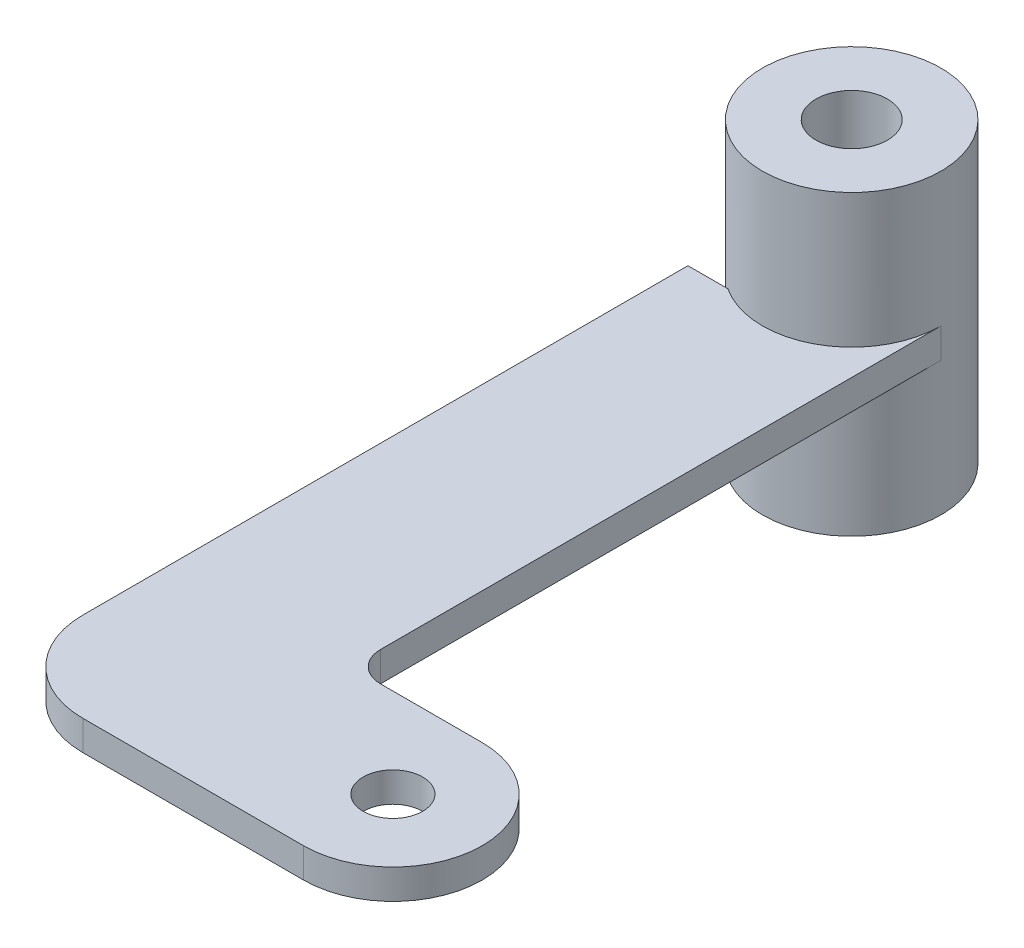
ISO-10303-21;
HEADER;
FILE_DESCRIPTION(('STEP AP214'),'2;1');
FILE_NAME('part.step','',(''),(''),'','','');
FILE_SCHEMA(('AUTOMOTIVE_DESIGN { 1 0 10303 214 1 1 1 1 }'));
ENDSEC;
DATA;
#1=APPLICATION_CONTEXT('core data for automotive mechanical design processes');
#2=APPLICATION_PROTOCOL_DEFINITION('international standard','automotive_design',2000,#1);
#3=PRODUCT_CONTEXT('',#1,'mechanical');
#4=PRODUCT('Part','Part','',(#3));
#5=PRODUCT_RELATED_PRODUCT_CATEGORY('part','',(#4));
#6=PRODUCT_DEFINITION_FORMATION('','',#4);
#7=PRODUCT_DEFINITION_CONTEXT('part definition',#1,'design');
#8=PRODUCT_DEFINITION('design','',#6,#7);
#9=PRODUCT_DEFINITION_SHAPE('','',#8);
#10=(LENGTH_UNIT() NAMED_UNIT(*) SI_UNIT(.MILLI.,.METRE.));
#11=(NAMED_UNIT(*) PLANE_ANGLE_UNIT() SI_UNIT($,.RADIAN.));
#12=(NAMED_UNIT(*) SI_UNIT($,.STERADIAN.) SOLID_ANGLE_UNIT());
#13=UNCERTAINTY_MEASURE_WITH_UNIT(LENGTH_MEASURE(1.E-05),#10,'distance_accuracy_value','');
#14=(GEOMETRIC_REPRESENTATION_CONTEXT(3) GLOBAL_UNCERTAINTY_ASSIGNED_CONTEXT((#13)) GLOBAL_UNIT_ASSIGNED_CONTEXT((#10,
#11,#12)) REPRESENTATION_CONTEXT('',''));
#15=CARTESIAN_POINT('',(0.,0.,0.));
#16=DIRECTION('',(0.,0.,1.));
#17=DIRECTION('',(1.,0.,0.));
#18=AXIS2_PLACEMENT_3D('',#15,#16,#17);
#19=CARTESIAN_POINT('',(6.,-5.,0.));
#20=DIRECTION('',(0.,1.,0.));
#21=DIRECTION('',(0.,0.,1.));
#22=AXIS2_PLACEMENT_3D('',#19,#20,#21);
#23=PLANE('',#22);
#24=CARTESIAN_POINT('',(0.,-5.,0.));
#25=DIRECTION('',(0.,1.,0.));
#26=DIRECTION('',(0.,0.,1.));
#27=AXIS2_PLACEMENT_3D('',#24,#25,#26);
#28=CIRCLE('',#27,5.99999999999999);
#29=CARTESIAN_POINT('',(0.,-5.,5.99999999999999));
#30=VERTEX_POINT('',#29);
#31=EDGE_CURVE('E166',#30,#30,#28,.T.);
#32=ORIENTED_EDGE('',*,*,#31,.F.);
#33=EDGE_LOOP('',(#32));
#34=FACE_BOUND('',#33,.T.);
#35=CARTESIAN_POINT('',(0.,-5.,0.));
#36=DIRECTION('',(0.,1.,0.));
#37=DIRECTION('',(0.,0.,1.));
#38=AXIS2_PLACEMENT_3D('',#35,#36,#37);
#39=CIRCLE('',#38,4.99999999999999);
#40=CARTESIAN_POINT('',(0.,-5.,4.99999999999999));
#41=VERTEX_POINT('',#40);
#42=EDGE_CURVE('E140',#41,#41,#39,.T.);
#43=ORIENTED_EDGE('',*,*,#42,.T.);
#44=EDGE_LOOP('',(#43));
#45=FACE_BOUND('',#44,.T.);
#46=ADVANCED_FACE('F43',(#34,#45),#23,.F.);
#47=CARTESIAN_POINT('',(0.,25.,0.));
#48=DIRECTION('',(0.,1.,0.));
#49=DIRECTION('',(0.,0.,1.));
#50=AXIS2_PLACEMENT_3D('',#47,#48,#49);
#51=CYLINDRICAL_SURFACE('',#50,5.99999999999999);
#52=CARTESIAN_POINT('',(0.,-25.,0.));
#53=DIRECTION('',(0.,1.,0.));
#54=DIRECTION('',(0.,0.,1.));
#55=AXIS2_PLACEMENT_3D('',#52,#53,#54);
#56=CIRCLE('',#55,5.99999999999999);
#57=CARTESIAN_POINT('',(0.,-25.,5.99999999999999));
#58=VERTEX_POINT('',#57);
#59=EDGE_CURVE('E163',#58,#58,#56,.T.);
#60=ORIENTED_EDGE('',*,*,#59,.F.);
#61=EDGE_LOOP('',(#60));
#62=FACE_BOUND('',#61,.T.);
#63=ORIENTED_EDGE('',*,*,#31,.T.);
#64=EDGE_LOOP('',(#63));
#65=FACE_BOUND('',#64,.T.);
#66=ADVANCED_FACE('F247',(#62,#65),#51,.F.);
#67=CARTESIAN_POINT('',(15.,-25.,0.));
#68=DIRECTION('',(0.,1.,0.));
#69=DIRECTION('',(0.,0.,1.));
#70=AXIS2_PLACEMENT_3D('',#67,#68,#69);
#71=PLANE('',#70);
#72=CARTESIAN_POINT('',(0.,-25.,0.));
#73=DIRECTION('',(0.,1.,0.));
#74=DIRECTION('',(0.,0.,1.));
#75=AXIS2_PLACEMENT_3D('',#72,#73,#74);
#76=CIRCLE('',#75,15.);
#77=CARTESIAN_POINT('',(0.,-25.,15.));
#78=VERTEX_POINT('',#77);
#79=EDGE_CURVE('E160',#78,#78,#76,.T.);
#80=ORIENTED_EDGE('',*,*,#79,.F.);
#81=EDGE_LOOP('',(#80));
#82=FACE_BOUND('',#81,.T.);
#83=ORIENTED_EDGE('',*,*,#59,.T.);
#84=EDGE_LOOP('',(#83));
#85=FACE_BOUND('',#84,.T.);
#86=ADVANCED_FACE('F252',(#82,#85),#71,.F.);
#87=CARTESIAN_POINT('',(0.,25.,0.));
#88=DIRECTION('',(0.,1.,0.));
#89=DIRECTION('',(0.,0.,1.));
#90=AXIS2_PLACEMENT_3D('',#87,#88,#89);
#91=CYLINDRICAL_SURFACE('',#90,15.);
#92=DIRECTION('',(0.,-1.,0.));
#93=VECTOR('',#92,1.);
#94=CARTESIAN_POINT('',(-8.29156197588848,2.5,12.5));
#95=LINE('',#94,#93);
#96=CARTESIAN_POINT('',(-8.29156197588848,2.5,12.5));
#97=VERTEX_POINT('',#96);
#98=CARTESIAN_POINT('',(-8.29156197588848,-2.5,12.5));
#99=VERTEX_POINT('',#98);
#100=EDGE_CURVE('E222',#97,#99,#95,.T.);
#101=ORIENTED_EDGE('',*,*,#100,.F.);
#102=CARTESIAN_POINT('',(0.,2.5,0.));
#103=DIRECTION('',(0.,1.,0.));
#104=DIRECTION('',(0.,0.,1.));
#105=AXIS2_PLACEMENT_3D('',#102,#103,#104);
#106=CIRCLE('',#105,15.);
#107=CARTESIAN_POINT('',(15.,2.5,0.));
#108=VERTEX_POINT('',#107);
#109=EDGE_CURVE('E196',#97,#108,#106,.T.);
#110=ORIENTED_EDGE('',*,*,#109,.T.);
#111=DIRECTION('',(0.,-1.,0.));
#112=VECTOR('',#111,1.);
#113=CARTESIAN_POINT('',(15.,2.5,0.));
#114=LINE('',#113,#112);
#115=CARTESIAN_POINT('',(15.,-2.5,0.));
#116=VERTEX_POINT('',#115);
#117=EDGE_CURVE('E145',#108,#116,#114,.T.);
#118=ORIENTED_EDGE('',*,*,#117,.T.);
#119=CARTESIAN_POINT('',(0.,-2.5,0.));
#120=DIRECTION('',(0.,1.,0.));
#121=DIRECTION('',(0.,0.,1.));
#122=AXIS2_PLACEMENT_3D('',#119,#120,#121);
#123=CIRCLE('',#122,15.);
#124=EDGE_CURVE('E213',#99,#116,#123,.T.);
#125=ORIENTED_EDGE('',*,*,#124,.F.);
#126=EDGE_LOOP('',(#101,#110,#118,#125));
#127=FACE_BOUND('',#126,.T.);
#128=CARTESIAN_POINT('',(0.,25.,0.));
#129=DIRECTION('',(0.,1.,0.));
#130=DIRECTION('',(0.,0.,1.));
#131=AXIS2_PLACEMENT_3D('',#128,#129,#130);
#132=CIRCLE('',#131,15.);
#133=CARTESIAN_POINT('',(0.,25.,15.));
#134=VERTEX_POINT('',#133);
#135=EDGE_CURVE('E157',#134,#134,#132,.T.);
#136=ORIENTED_EDGE('',*,*,#135,.F.);
#137=EDGE_LOOP('',(#136));
#138=FACE_BOUND('',#137,.T.);
#139=ORIENTED_EDGE('',*,*,#79,.T.);
#140=EDGE_LOOP('',(#139));
#141=FACE_BOUND('',#140,.T.);
#142=ADVANCED_FACE('F225',(#127,#138,#141),#91,.T.);
#143=CARTESIAN_POINT('',(5.99999999999999,25.,0.));
#144=DIRECTION('',(0.,-1.,0.));
#145=DIRECTION('',(0.,0.,-1.));
#146=AXIS2_PLACEMENT_3D('',#143,#144,#145);
#147=PLANE('',#146);
#148=CARTESIAN_POINT('',(0.,25.,0.));
#149=DIRECTION('',(0.,1.,0.));
#150=DIRECTION('',(0.,0.,1.));
#151=AXIS2_PLACEMENT_3D('',#148,#149,#150);
#152=CIRCLE('',#151,5.99999999999998);
#153=CARTESIAN_POINT('',(0.,25.,5.99999999999998));
#154=VERTEX_POINT('',#153);
#155=EDGE_CURVE('E154',#154,#154,#152,.T.);
#156=ORIENTED_EDGE('',*,*,#155,.F.);
#157=EDGE_LOOP('',(#156));
#158=FACE_BOUND('',#157,.T.);
#159=ORIENTED_EDGE('',*,*,#135,.T.);
#160=EDGE_LOOP('',(#159));
#161=FACE_BOUND('',#160,.T.);
#162=ADVANCED_FACE('F263',(#158,#161),#147,.F.);
#163=CARTESIAN_POINT('',(0.,25.,0.));
#164=DIRECTION('',(0.,1.,0.));
#165=DIRECTION('',(0.,0.,1.));
#166=AXIS2_PLACEMENT_3D('',#163,#164,#165);
#167=CYLINDRICAL_SURFACE('',#166,5.99999999999998);
#168=CARTESIAN_POINT('',(0.,5.,0.));
#169=DIRECTION('',(0.,1.,0.));
#170=DIRECTION('',(0.,0.,1.));
#171=AXIS2_PLACEMENT_3D('',#168,#169,#170);
#172=CIRCLE('',#171,5.99999999999999);
#173=CARTESIAN_POINT('',(0.,5.,5.99999999999999));
#174=VERTEX_POINT('',#173);
#175=EDGE_CURVE('E151',#174,#174,#172,.T.);
#176=ORIENTED_EDGE('',*,*,#175,.F.);
#177=EDGE_LOOP('',(#176));
#178=FACE_BOUND('',#177,.T.);
#179=ORIENTED_EDGE('',*,*,#155,.T.);
#180=EDGE_LOOP('',(#179));
#181=FACE_BOUND('',#180,.T.);
#182=ADVANCED_FACE('F266',(#178,#181),#167,.F.);
#183=CARTESIAN_POINT('',(5.,5.,0.));
#184=DIRECTION('',(0.,-1.,0.));
#185=DIRECTION('',(0.,0.,-1.));
#186=AXIS2_PLACEMENT_3D('',#183,#184,#185);
#187=PLANE('',#186);
#188=CARTESIAN_POINT('',(0.,5.,0.));
#189=DIRECTION('',(0.,1.,0.));
#190=DIRECTION('',(0.,0.,1.));
#191=AXIS2_PLACEMENT_3D('',#188,#189,#190);
#192=CIRCLE('',#191,4.99999999999999);
#193=CARTESIAN_POINT('',(0.,5.,4.99999999999999));
#194=VERTEX_POINT('',#193);
#195=EDGE_CURVE('E143',#194,#194,#192,.T.);
#196=ORIENTED_EDGE('',*,*,#195,.F.);
#197=EDGE_LOOP('',(#196));
#198=FACE_BOUND('',#197,.T.);
#199=ORIENTED_EDGE('',*,*,#175,.T.);
#200=EDGE_LOOP('',(#199));
#201=FACE_BOUND('',#200,.T.);
#202=ADVANCED_FACE('F270',(#198,#201),#187,.F.);
#203=CARTESIAN_POINT('',(0.,25.,0.));
#204=DIRECTION('',(0.,1.,0.));
#205=DIRECTION('',(0.,0.,1.));
#206=AXIS2_PLACEMENT_3D('',#203,#204,#205);
#207=CYLINDRICAL_SURFACE('',#206,4.99999999999999);
#208=ORIENTED_EDGE('',*,*,#42,.F.);
#209=EDGE_LOOP('',(#208));
#210=FACE_BOUND('',#209,.T.);
#211=ORIENTED_EDGE('',*,*,#195,.T.);
#212=EDGE_LOOP('',(#211));
#213=FACE_BOUND('',#212,.T.);
#214=ADVANCED_FACE('F274',(#210,#213),#207,.F.);
#215=CARTESIAN_POINT('',(0.,2.5,129.126781955418));
#216=DIRECTION('',(0.,0.,-1.));
#217=DIRECTION('',(-1.,0.,0.));
#218=AXIS2_PLACEMENT_3D('',#215,#216,#217);
#219=PLANE('',#218);
#220=DIRECTION('',(1.,0.,0.));
#221=VECTOR('',#220,1.);
#222=CARTESIAN_POINT('',(0.,2.5,129.126781955418));
#223=LINE('',#222,#221);
#224=CARTESIAN_POINT('',(0.,2.5,129.126781955418));
#225=VERTEX_POINT('',#224);
#226=CARTESIAN_POINT('',(37.0820393249942,2.5,129.126781955418));
#227=VERTEX_POINT('',#226);
#228=EDGE_CURVE('E113',#225,#227,#223,.T.);
#229=ORIENTED_EDGE('',*,*,#228,.F.);
#230=DIRECTION('',(0.,-1.,0.));
#231=VECTOR('',#230,1.);
#232=CARTESIAN_POINT('',(0.,-2.5,129.126781955418));
#233=LINE('',#232,#231);
#234=CARTESIAN_POINT('',(0.,-2.5,129.126781955418));
#235=VERTEX_POINT('',#234);
#236=EDGE_CURVE('E169',#225,#235,#233,.T.);
#237=ORIENTED_EDGE('',*,*,#236,.T.);
#238=DIRECTION('',(1.,0.,0.));
#239=VECTOR('',#238,1.);
#240=CARTESIAN_POINT('',(0.,-2.5,129.126781955418));
#241=LINE('',#240,#239);
#242=CARTESIAN_POINT('',(37.0820393249942,-2.5,129.126781955418));
#243=VERTEX_POINT('',#242);
#244=EDGE_CURVE('E138',#235,#243,#241,.T.);
#245=ORIENTED_EDGE('',*,*,#244,.T.);
#246=DIRECTION('',(0.,-1.,0.));
#247=VECTOR('',#246,1.);
#248=CARTESIAN_POINT('',(37.0820393249942,2.5,129.126781955418));
#249=LINE('',#248,#247);
#250=EDGE_CURVE('E131',#227,#243,#249,.T.);
#251=ORIENTED_EDGE('',*,*,#250,.F.);
#252=EDGE_LOOP('',(#229,#237,#245,#251));
#253=FACE_BOUND('',#252,.T.);
#254=ADVANCED_FACE('F136',(#253),#219,.F.);
#255=CARTESIAN_POINT('',(37.0820393249942,2.5,114.126781955418));
#256=DIRECTION('',(0.,-1.,0.));
#257=DIRECTION('',(0.,0.,-1.));
#258=AXIS2_PLACEMENT_3D('',#255,#256,#257);
#259=CYLINDRICAL_SURFACE('',#258,15.);
#260=CARTESIAN_POINT('',(37.0820393249942,-2.5,114.126781955418));
#261=DIRECTION('',(0.,1.,0.));
#262=DIRECTION('',(0.,0.,1.));
#263=AXIS2_PLACEMENT_3D('',#260,#261,#262);
#264=CIRCLE('',#263,15.);
#265=CARTESIAN_POINT('',(37.0820393249942,-2.5,99.1267819554182));
#266=VERTEX_POINT('',#265);
#267=EDGE_CURVE('E189',#243,#266,#264,.T.);
#268=ORIENTED_EDGE('',*,*,#267,.T.);
#269=DIRECTION('',(0.,-1.,0.));
#270=VECTOR('',#269,1.);
#271=CARTESIAN_POINT('',(37.0820393249942,2.5,99.1267819554182));
#272=LINE('',#271,#270);
#273=CARTESIAN_POINT('',(37.0820393249942,2.5,99.1267819554182));
#274=VERTEX_POINT('',#273);
#275=EDGE_CURVE('E133',#274,#266,#272,.T.);
#276=ORIENTED_EDGE('',*,*,#275,.F.);
#277=CARTESIAN_POINT('',(37.0820393249942,2.5,114.126781955418));
#278=DIRECTION('',(0.,1.,0.));
#279=DIRECTION('',(0.,0.,1.));
#280=AXIS2_PLACEMENT_3D('',#277,#278,#279);
#281=CIRCLE('',#280,15.);
#282=EDGE_CURVE('E117',#227,#274,#281,.T.);
#283=ORIENTED_EDGE('',*,*,#282,.F.);
#284=ORIENTED_EDGE('',*,*,#250,.T.);
#285=EDGE_LOOP('',(#268,#276,#283,#284));
#286=FACE_BOUND('',#285,.T.);
#287=ADVANCED_FACE('F130',(#286),#259,.T.);
#288=CARTESIAN_POINT('',(0.,2.5,99.1267819554182));
#289=DIRECTION('',(0.,0.,-1.));
#290=DIRECTION('',(-1.,0.,0.));
#291=AXIS2_PLACEMENT_3D('',#288,#289,#290);
#292=PLANE('',#291);
#293=DIRECTION('',(1.,0.,0.));
#294=VECTOR('',#293,1.);
#295=CARTESIAN_POINT('',(0.,-2.5,99.1267819554182));
#296=LINE('',#295,#294);
#297=CARTESIAN_POINT('',(20.,-2.5,99.1267819554182));
#298=VERTEX_POINT('',#297);
#299=EDGE_CURVE('E182',#298,#266,#296,.T.);
#300=ORIENTED_EDGE('',*,*,#299,.F.);
#301=DIRECTION('',(0.,-1.,0.));
#302=VECTOR('',#301,1.);
#303=CARTESIAN_POINT('',(20.,2.5,99.1267819554182));
#304=LINE('',#303,#302);
#305=CARTESIAN_POINT('',(20.,2.5,99.1267819554182));
#306=VERTEX_POINT('',#305);
#307=EDGE_CURVE('E64',#298,#306,#304,.F.);
#308=ORIENTED_EDGE('',*,*,#307,.T.);
#309=DIRECTION('',(1.,0.,0.));
#310=VECTOR('',#309,1.);
#311=CARTESIAN_POINT('',(0.,2.5,99.1267819554182));
#312=LINE('',#311,#310);
#313=EDGE_CURVE('E134',#306,#274,#312,.T.);
#314=ORIENTED_EDGE('',*,*,#313,.T.);
#315=ORIENTED_EDGE('',*,*,#275,.T.);
#316=EDGE_LOOP('',(#300,#308,#314,#315));
#317=FACE_BOUND('',#316,.T.);
#318=ADVANCED_FACE('F188',(#317),#292,.T.);
#319=CARTESIAN_POINT('',(15.,2.5,0.));
#320=DIRECTION('',(1.,0.,0.));
#321=DIRECTION('',(0.,0.,-1.));
#322=AXIS2_PLACEMENT_3D('',#319,#320,#321);
#323=PLANE('',#322);
#324=DIRECTION('',(0.,0.,1.));
#325=VECTOR('',#324,1.);
#326=CARTESIAN_POINT('',(15.,2.5,0.));
#327=LINE('',#326,#325);
#328=CARTESIAN_POINT('',(15.,2.5,94.1267819554182));
#329=VERTEX_POINT('',#328);
#330=EDGE_CURVE('E194',#108,#329,#327,.T.);
#331=ORIENTED_EDGE('',*,*,#330,.T.);
#332=DIRECTION('',(0.,-1.,0.));
#333=VECTOR('',#332,1.);
#334=CARTESIAN_POINT('',(15.,-2.5,94.1267819554182));
#335=LINE('',#334,#333);
#336=CARTESIAN_POINT('',(15.,-2.5,94.1267819554182));
#337=VERTEX_POINT('',#336);
#338=EDGE_CURVE('E176',#329,#337,#335,.T.);
#339=ORIENTED_EDGE('',*,*,#338,.T.);
#340=DIRECTION('',(0.,0.,1.));
#341=VECTOR('',#340,1.);
#342=CARTESIAN_POINT('',(15.,-2.5,0.));
#343=LINE('',#342,#341);
#344=EDGE_CURVE('E185',#116,#337,#343,.T.);
#345=ORIENTED_EDGE('',*,*,#344,.F.);
#346=ORIENTED_EDGE('',*,*,#117,.F.);
#347=EDGE_LOOP('',(#331,#339,#345,#346));
#348=FACE_BOUND('',#347,.T.);
#349=ADVANCED_FACE('F192',(#348),#323,.T.);
#350=CARTESIAN_POINT('',(0.,2.5,12.5));
#351=DIRECTION('',(0.,0.,-1.));
#352=DIRECTION('',(-1.,0.,0.));
#353=AXIS2_PLACEMENT_3D('',#350,#351,#352);
#354=PLANE('',#353);
#355=DIRECTION('',(1.,0.,0.));
#356=VECTOR('',#355,1.);
#357=CARTESIAN_POINT('',(0.,-2.5,12.5));
#358=LINE('',#357,#356);
#359=CARTESIAN_POINT('',(-15.,-2.5,12.5));
#360=VERTEX_POINT('',#359);
#361=EDGE_CURVE('E215',#360,#99,#358,.T.);
#362=ORIENTED_EDGE('',*,*,#361,.F.);
#363=DIRECTION('',(0.,-1.,0.));
#364=VECTOR('',#363,1.);
#365=CARTESIAN_POINT('',(-15.,2.5,12.5));
#366=LINE('',#365,#364);
#367=CARTESIAN_POINT('',(-15.,2.5,12.5));
#368=VERTEX_POINT('',#367);
#369=EDGE_CURVE('E206',#368,#360,#366,.T.);
#370=ORIENTED_EDGE('',*,*,#369,.F.);
#371=DIRECTION('',(1.,0.,0.));
#372=VECTOR('',#371,1.);
#373=CARTESIAN_POINT('',(0.,2.5,12.5));
#374=LINE('',#373,#372);
#375=EDGE_CURVE('E198',#368,#97,#374,.T.);
#376=ORIENTED_EDGE('',*,*,#375,.T.);
#377=ORIENTED_EDGE('',*,*,#100,.T.);
#378=EDGE_LOOP('',(#362,#370,#376,#377));
#379=FACE_BOUND('',#378,.T.);
#380=ADVANCED_FACE('F231',(#379),#354,.T.);
#381=CARTESIAN_POINT('',(37.0820393249942,2.5,114.126781955418));
#382=DIRECTION('',(0.,-1.,0.));
#383=DIRECTION('',(0.,0.,-1.));
#384=AXIS2_PLACEMENT_3D('',#381,#382,#383);
#385=CYLINDRICAL_SURFACE('',#384,5.);
#386=CARTESIAN_POINT('',(37.0820393249942,2.5,114.126781955418));
#387=DIRECTION('',(0.,1.,0.));
#388=DIRECTION('',(0.,0.,1.));
#389=AXIS2_PLACEMENT_3D('',#386,#387,#388);
#390=CIRCLE('',#389,5.);
#391=CARTESIAN_POINT('',(37.0820393249942,2.5,119.126781955418));
#392=VERTEX_POINT('',#391);
#393=EDGE_CURVE('E125',#392,#392,#390,.T.);
#394=ORIENTED_EDGE('',*,*,#393,.T.);
#395=EDGE_LOOP('',(#394));
#396=FACE_BOUND('',#395,.T.);
#397=CARTESIAN_POINT('',(37.0820393249942,-2.5,114.126781955418));
#398=DIRECTION('',(0.,1.,0.));
#399=DIRECTION('',(0.,0.,1.));
#400=AXIS2_PLACEMENT_3D('',#397,#398,#399);
#401=CIRCLE('',#400,5.);
#402=CARTESIAN_POINT('',(37.0820393249942,-2.5,119.126781955418));
#403=VERTEX_POINT('',#402);
#404=EDGE_CURVE('E207',#403,#403,#401,.T.);
#405=ORIENTED_EDGE('',*,*,#404,.F.);
#406=EDGE_LOOP('',(#405));
#407=FACE_BOUND('',#406,.T.);
#408=ADVANCED_FACE('F279',(#396,#407),#385,.F.);
#409=CARTESIAN_POINT('',(-15.,2.5,0.));
#410=DIRECTION('',(-1.,0.,0.));
#411=DIRECTION('',(0.,0.,1.));
#412=AXIS2_PLACEMENT_3D('',#409,#410,#411);
#413=PLANE('',#412);
#414=DIRECTION('',(0.,0.,-1.));
#415=VECTOR('',#414,1.);
#416=CARTESIAN_POINT('',(-15.,-2.5,0.));
#417=LINE('',#416,#415);
#418=CARTESIAN_POINT('',(-15.,-2.5,114.126781955418));
#419=VERTEX_POINT('',#418);
#420=EDGE_CURVE('E218',#419,#360,#417,.T.);
#421=ORIENTED_EDGE('',*,*,#420,.F.);
#422=DIRECTION('',(0.,-1.,0.));
#423=VECTOR('',#422,1.);
#424=CARTESIAN_POINT('',(-15.,2.5,114.126781955418));
#425=LINE('',#424,#423);
#426=CARTESIAN_POINT('',(-15.,2.5,114.126781955418));
#427=VERTEX_POINT('',#426);
#428=EDGE_CURVE('E173',#419,#427,#425,.F.);
#429=ORIENTED_EDGE('',*,*,#428,.T.);
#430=DIRECTION('',(0.,0.,-1.));
#431=VECTOR('',#430,1.);
#432=CARTESIAN_POINT('',(-15.,2.5,0.));
#433=LINE('',#432,#431);
#434=EDGE_CURVE('E204',#427,#368,#433,.T.);
#435=ORIENTED_EDGE('',*,*,#434,.T.);
#436=ORIENTED_EDGE('',*,*,#369,.T.);
#437=EDGE_LOOP('',(#421,#429,#435,#436));
#438=FACE_BOUND('',#437,.T.);
#439=ADVANCED_FACE('F234',(#438),#413,.T.);
#440=CARTESIAN_POINT('',(0.,2.5,0.));
#441=DIRECTION('',(0.,1.,0.));
#442=DIRECTION('',(0.,0.,1.));
#443=AXIS2_PLACEMENT_3D('',#440,#441,#442);
#444=PLANE('',#443);
#445=ORIENTED_EDGE('',*,*,#393,.F.);
#446=EDGE_LOOP('',(#445));
#447=FACE_BOUND('',#446,.T.);
#448=ORIENTED_EDGE('',*,*,#434,.F.);
#449=CARTESIAN_POINT('',(0.,2.5,114.126781955418));
#450=DIRECTION('',(0.,1.,0.));
#451=DIRECTION('',(0.,0.,1.));
#452=AXIS2_PLACEMENT_3D('',#449,#450,#451);
#453=CIRCLE('',#452,15.);
#454=EDGE_CURVE('E120',#427,#225,#453,.T.);
#455=ORIENTED_EDGE('',*,*,#454,.T.);
#456=ORIENTED_EDGE('',*,*,#228,.T.);
#457=ORIENTED_EDGE('',*,*,#282,.T.);
#458=ORIENTED_EDGE('',*,*,#313,.F.);
#459=CARTESIAN_POINT('',(20.,2.5,94.1267819554182));
#460=DIRECTION('',(0.,1.,0.));
#461=DIRECTION('',(0.,0.,1.));
#462=AXIS2_PLACEMENT_3D('',#459,#460,#461);
#463=CIRCLE('',#462,5.);
#464=EDGE_CURVE('E12',#306,#329,#463,.F.);
#465=ORIENTED_EDGE('',*,*,#464,.T.);
#466=ORIENTED_EDGE('',*,*,#330,.F.);
#467=ORIENTED_EDGE('',*,*,#109,.F.);
#468=ORIENTED_EDGE('',*,*,#375,.F.);
#469=EDGE_LOOP('',(#448,#455,#456,#457,#458,#465,#466,#467,#468));
#470=FACE_BOUND('',#469,.T.);
#471=ADVANCED_FACE('F116',(#447,#470),#444,.T.);
#472=CARTESIAN_POINT('',(0.,-2.5,0.));
#473=DIRECTION('',(0.,1.,0.));
#474=DIRECTION('',(0.,0.,1.));
#475=AXIS2_PLACEMENT_3D('',#472,#473,#474);
#476=PLANE('',#475);
#477=ORIENTED_EDGE('',*,*,#404,.T.);
#478=EDGE_LOOP('',(#477));
#479=FACE_BOUND('',#478,.T.);
#480=ORIENTED_EDGE('',*,*,#244,.F.);
#481=CARTESIAN_POINT('',(0.,-2.5,114.126781955418));
#482=DIRECTION('',(0.,1.,0.));
#483=DIRECTION('',(0.,0.,1.));
#484=AXIS2_PLACEMENT_3D('',#481,#482,#483);
#485=CIRCLE('',#484,15.);
#486=EDGE_CURVE('E171',#235,#419,#485,.F.);
#487=ORIENTED_EDGE('',*,*,#486,.T.);
#488=ORIENTED_EDGE('',*,*,#420,.T.);
#489=ORIENTED_EDGE('',*,*,#361,.T.);
#490=ORIENTED_EDGE('',*,*,#124,.T.);
#491=ORIENTED_EDGE('',*,*,#344,.T.);
#492=CARTESIAN_POINT('',(20.,-2.5,94.1267819554182));
#493=DIRECTION('',(0.,1.,0.));
#494=DIRECTION('',(0.,0.,1.));
#495=AXIS2_PLACEMENT_3D('',#492,#493,#494);
#496=CIRCLE('',#495,5.);
#497=EDGE_CURVE('E51',#337,#298,#496,.T.);
#498=ORIENTED_EDGE('',*,*,#497,.T.);
#499=ORIENTED_EDGE('',*,*,#299,.T.);
#500=ORIENTED_EDGE('',*,*,#267,.F.);
#501=EDGE_LOOP('',(#480,#487,#488,#489,#490,#491,#498,#499,#500));
#502=FACE_BOUND('',#501,.T.);
#503=ADVANCED_FACE('F181',(#479,#502),#476,.F.);
#504=CARTESIAN_POINT('',(0.,2.5,114.126781955418));
#505=DIRECTION('',(0.,1.,0.));
#506=DIRECTION('',(0.,0.,1.));
#507=AXIS2_PLACEMENT_3D('',#504,#505,#506);
#508=CYLINDRICAL_SURFACE('',#507,15.);
#509=ORIENTED_EDGE('',*,*,#454,.F.);
#510=ORIENTED_EDGE('',*,*,#428,.F.);
#511=ORIENTED_EDGE('',*,*,#486,.F.);
#512=ORIENTED_EDGE('',*,*,#236,.F.);
#513=EDGE_LOOP('',(#509,#510,#511,#512));
#514=FACE_BOUND('',#513,.T.);
#515=ADVANCED_FACE('F237',(#514),#508,.T.);
#516=CARTESIAN_POINT('',(20.,2.5,94.1267819554182));
#517=DIRECTION('',(0.,1.,0.));
#518=DIRECTION('',(0.,0.,1.));
#519=AXIS2_PLACEMENT_3D('',#516,#517,#518);
#520=CYLINDRICAL_SURFACE('',#519,5.);
#521=ORIENTED_EDGE('',*,*,#464,.F.);
#522=ORIENTED_EDGE('',*,*,#307,.F.);
#523=ORIENTED_EDGE('',*,*,#497,.F.);
#524=ORIENTED_EDGE('',*,*,#338,.F.);
#525=EDGE_LOOP('',(#521,#522,#523,#524));
#526=FACE_BOUND('',#525,.T.);
#527=ADVANCED_FACE('F45',(#526),#520,.F.);
#528=CLOSED_SHELL('',(#46,#66,#86,#142,#162,#182,#202,#214,#254,#287,#318,#349,#380,#408,#439,
#471,#503,#515,#527));
#529=MANIFOLD_SOLID_BREP('B2',#528);
#530=ADVANCED_BREP_SHAPE_REPRESENTATION('',(#18,#529),#14);
#531=SHAPE_DEFINITION_REPRESENTATION(#9,#530);
ENDSEC;
END-ISO-10303-21;
